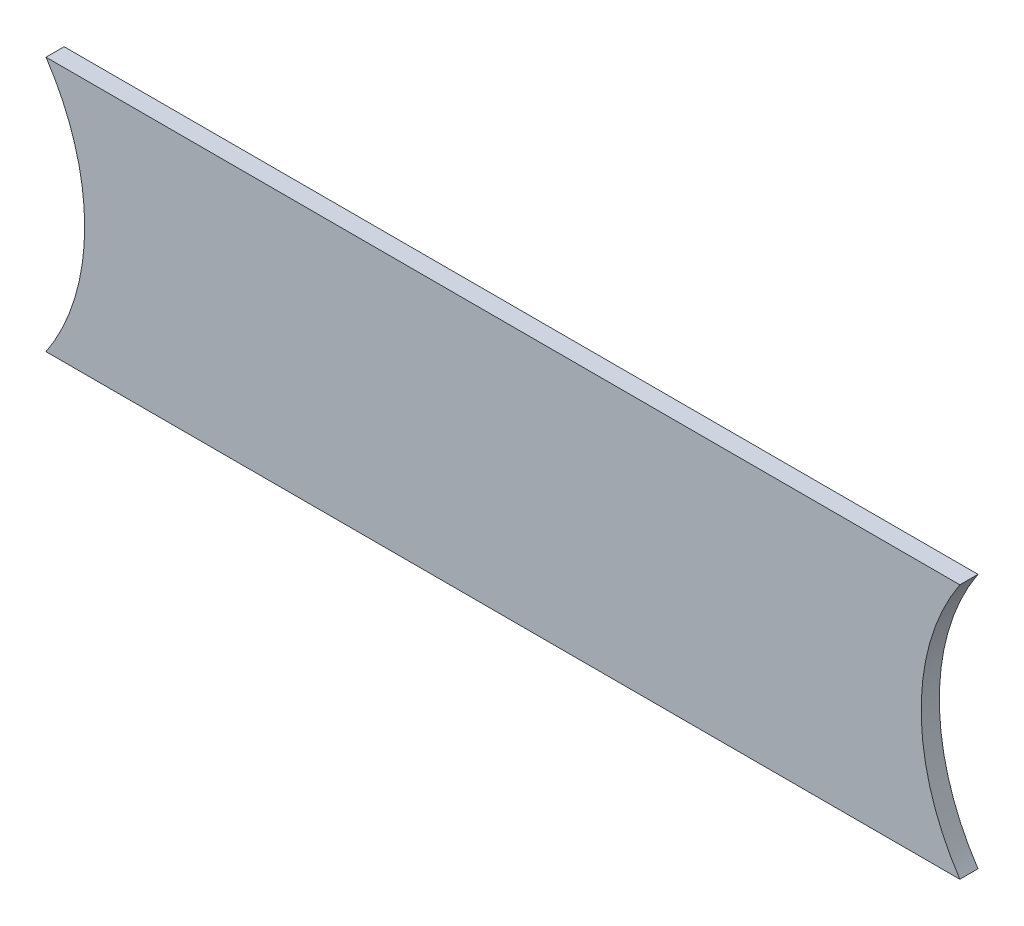
ISO-10303-21;
HEADER;
FILE_DESCRIPTION(('STEP AP214'),'2;1');
FILE_NAME('part.step','',(''),(''),'','','');
FILE_SCHEMA(('AUTOMOTIVE_DESIGN { 1 0 10303 214 1 1 1 1 }'));
ENDSEC;
DATA;
#1=APPLICATION_CONTEXT('core data for automotive mechanical design processes');
#2=APPLICATION_PROTOCOL_DEFINITION('international standard','automotive_design',2000,#1);
#3=PRODUCT_CONTEXT('',#1,'mechanical');
#4=PRODUCT('Part','Part','',(#3));
#5=PRODUCT_RELATED_PRODUCT_CATEGORY('part','',(#4));
#6=PRODUCT_DEFINITION_FORMATION('','',#4);
#7=PRODUCT_DEFINITION_CONTEXT('part definition',#1,'design');
#8=PRODUCT_DEFINITION('design','',#6,#7);
#9=PRODUCT_DEFINITION_SHAPE('','',#8);
#10=(LENGTH_UNIT() NAMED_UNIT(*) SI_UNIT(.MILLI.,.METRE.));
#11=(NAMED_UNIT(*) PLANE_ANGLE_UNIT() SI_UNIT($,.RADIAN.));
#12=(NAMED_UNIT(*) SI_UNIT($,.STERADIAN.) SOLID_ANGLE_UNIT());
#13=UNCERTAINTY_MEASURE_WITH_UNIT(LENGTH_MEASURE(1.E-05),#10,'distance_accuracy_value','');
#14=(GEOMETRIC_REPRESENTATION_CONTEXT(3) GLOBAL_UNCERTAINTY_ASSIGNED_CONTEXT((#13)) GLOBAL_UNIT_ASSIGNED_CONTEXT((#10,
#11,#12)) REPRESENTATION_CONTEXT('',''));
#15=CARTESIAN_POINT('',(0.,0.,0.));
#16=DIRECTION('',(0.,0.,1.));
#17=DIRECTION('',(1.,0.,0.));
#18=AXIS2_PLACEMENT_3D('',#15,#16,#17);
#19=CARTESIAN_POINT('',(81.7341749903459,116.7500205,0.));
#20=DIRECTION('',(0.,1.,0.));
#21=DIRECTION('',(1.,0.,0.));
#22=AXIS2_PLACEMENT_3D('',#19,#20,#21);
#23=PLANE('',#22);
#24=DIRECTION('',(1.,0.,0.));
#25=VECTOR('',#24,1.);
#26=CARTESIAN_POINT('',(81.36001,116.7500205,0.03556));
#27=LINE('',#26,#25);
#28=CARTESIAN_POINT('',(81.7341749903459,116.7500205,0.03556));
#29=VERTEX_POINT('',#28);
#30=CARTESIAN_POINT('',(83.5258450096541,116.7500205,0.03556));
#31=VERTEX_POINT('',#30);
#32=EDGE_CURVE('E11',#29,#31,#27,.T.);
#33=ORIENTED_EDGE('',*,*,#32,.F.);
#34=DIRECTION('',(0.,0.,1.));
#35=VECTOR('',#34,1.);
#36=CARTESIAN_POINT('',(81.7341749903459,116.7500205,0.));
#37=LINE('',#36,#35);
#38=CARTESIAN_POINT('',(81.7341749903459,116.7500205,0.));
#39=VERTEX_POINT('',#38);
#40=EDGE_CURVE('E24',#39,#29,#37,.T.);
#41=ORIENTED_EDGE('',*,*,#40,.F.);
#42=DIRECTION('',(1.,0.,0.));
#43=VECTOR('',#42,1.);
#44=CARTESIAN_POINT('',(81.36001,116.7500205,0.));
#45=LINE('',#44,#43);
#46=CARTESIAN_POINT('',(83.5258450096541,116.7500205,0.));
#47=VERTEX_POINT('',#46);
#48=EDGE_CURVE('E82',#39,#47,#45,.T.);
#49=ORIENTED_EDGE('',*,*,#48,.T.);
#50=DIRECTION('',(0.,0.,1.));
#51=VECTOR('',#50,1.);
#52=CARTESIAN_POINT('',(83.5258450096541,116.7500205,0.));
#53=LINE('',#52,#51);
#54=EDGE_CURVE('E37',#47,#31,#53,.T.);
#55=ORIENTED_EDGE('',*,*,#54,.T.);
#56=EDGE_LOOP('',(#33,#41,#49,#55));
#57=FACE_BOUND('',#56,.T.);
#58=ADVANCED_FACE('F17',(#57),#23,.F.);
#59=CARTESIAN_POINT('',(83.90001,117.00002,0.));
#60=DIRECTION('',(0.,0.,-1.));
#61=DIRECTION('',(1.,0.,0.));
#62=AXIS2_PLACEMENT_3D('',#59,#60,#61);
#63=CYLINDRICAL_SURFACE('',#62,0.4499991);
#64=DIRECTION('',(0.,0.,1.));
#65=VECTOR('',#64,1.);
#66=CARTESIAN_POINT('',(83.5258450096541,117.2500195,0.));
#67=LINE('',#66,#65);
#68=CARTESIAN_POINT('',(83.5258450096541,117.2500195,0.));
#69=VERTEX_POINT('',#68);
#70=CARTESIAN_POINT('',(83.5258450096541,117.2500195,0.03556));
#71=VERTEX_POINT('',#70);
#72=EDGE_CURVE('E97',#69,#71,#67,.T.);
#73=ORIENTED_EDGE('',*,*,#72,.T.);
#74=CARTESIAN_POINT('',(83.90001,117.00002,0.03556));
#75=DIRECTION('',(0.,0.,1.));
#76=DIRECTION('',(1.,0.,0.));
#77=AXIS2_PLACEMENT_3D('',#74,#75,#76);
#78=CIRCLE('',#77,0.4499991);
#79=EDGE_CURVE('E94',#71,#31,#78,.T.);
#80=ORIENTED_EDGE('',*,*,#79,.T.);
#81=ORIENTED_EDGE('',*,*,#54,.F.);
#82=CARTESIAN_POINT('',(83.90001,117.00002,0.));
#83=DIRECTION('',(0.,0.,1.));
#84=DIRECTION('',(1.,0.,0.));
#85=AXIS2_PLACEMENT_3D('',#82,#83,#84);
#86=CIRCLE('',#85,0.4499991);
#87=EDGE_CURVE('E92',#69,#47,#86,.T.);
#88=ORIENTED_EDGE('',*,*,#87,.F.);
#89=EDGE_LOOP('',(#73,#80,#81,#88));
#90=FACE_BOUND('',#89,.T.);
#91=ADVANCED_FACE('F102',(#90),#63,.F.);
#92=CARTESIAN_POINT('',(83.5258450096541,117.2500195,0.));
#93=DIRECTION('',(0.,-1.,0.));
#94=DIRECTION('',(-1.,0.,0.));
#95=AXIS2_PLACEMENT_3D('',#92,#93,#94);
#96=PLANE('',#95);
#97=DIRECTION('',(-1.,0.,0.));
#98=VECTOR('',#97,1.);
#99=CARTESIAN_POINT('',(83.90001,117.2500195,0.03556));
#100=LINE('',#99,#98);
#101=CARTESIAN_POINT('',(81.7341749903459,117.2500195,0.03556));
#102=VERTEX_POINT('',#101);
#103=EDGE_CURVE('E89',#71,#102,#100,.T.);
#104=ORIENTED_EDGE('',*,*,#103,.F.);
#105=ORIENTED_EDGE('',*,*,#72,.F.);
#106=DIRECTION('',(-1.,0.,0.));
#107=VECTOR('',#106,1.);
#108=CARTESIAN_POINT('',(83.90001,117.2500195,0.));
#109=LINE('',#108,#107);
#110=CARTESIAN_POINT('',(81.7341749903459,117.2500195,0.));
#111=VERTEX_POINT('',#110);
#112=EDGE_CURVE('E87',#69,#111,#109,.T.);
#113=ORIENTED_EDGE('',*,*,#112,.T.);
#114=DIRECTION('',(0.,0.,1.));
#115=VECTOR('',#114,1.);
#116=CARTESIAN_POINT('',(81.7341749903459,117.2500195,0.));
#117=LINE('',#116,#115);
#118=EDGE_CURVE('E69',#111,#102,#117,.T.);
#119=ORIENTED_EDGE('',*,*,#118,.T.);
#120=EDGE_LOOP('',(#104,#105,#113,#119));
#121=FACE_BOUND('',#120,.T.);
#122=ADVANCED_FACE('F108',(#121),#96,.F.);
#123=CARTESIAN_POINT('',(81.36001,117.00002,0.));
#124=DIRECTION('',(0.,0.,-1.));
#125=DIRECTION('',(1.,0.,0.));
#126=AXIS2_PLACEMENT_3D('',#123,#124,#125);
#127=CYLINDRICAL_SURFACE('',#126,0.4499991);
#128=DIRECTION('',(0.,0.,1.));
#129=VECTOR('',#128,1.);
#130=CARTESIAN_POINT('',(81.8100091,117.00002,0.));
#131=LINE('',#130,#129);
#132=CARTESIAN_POINT('',(81.8100091,117.00002,0.));
#133=VERTEX_POINT('',#132);
#134=CARTESIAN_POINT('',(81.8100091,117.00002,0.03556));
#135=VERTEX_POINT('',#134);
#136=EDGE_CURVE('E59',#133,#135,#131,.T.);
#137=ORIENTED_EDGE('',*,*,#136,.T.);
#138=CARTESIAN_POINT('',(81.36001,117.00002,0.03556));
#139=DIRECTION('',(0.,0.,1.));
#140=DIRECTION('',(1.,0.,0.));
#141=AXIS2_PLACEMENT_3D('',#138,#139,#140);
#142=CIRCLE('',#141,0.4499991);
#143=EDGE_CURVE('E70',#135,#102,#142,.T.);
#144=ORIENTED_EDGE('',*,*,#143,.T.);
#145=ORIENTED_EDGE('',*,*,#118,.F.);
#146=CARTESIAN_POINT('',(81.36001,117.00002,0.));
#147=DIRECTION('',(0.,0.,1.));
#148=DIRECTION('',(1.,0.,0.));
#149=AXIS2_PLACEMENT_3D('',#146,#147,#148);
#150=CIRCLE('',#149,0.4499991);
#151=EDGE_CURVE('E73',#133,#111,#150,.T.);
#152=ORIENTED_EDGE('',*,*,#151,.F.);
#153=EDGE_LOOP('',(#137,#144,#145,#152));
#154=FACE_BOUND('',#153,.T.);
#155=ADVANCED_FACE('F74',(#154),#127,.F.);
#156=CARTESIAN_POINT('',(81.36001,117.00002,0.));
#157=DIRECTION('',(0.,0.,-1.));
#158=DIRECTION('',(1.,0.,0.));
#159=AXIS2_PLACEMENT_3D('',#156,#157,#158);
#160=CYLINDRICAL_SURFACE('',#159,0.4499991);
#161=ORIENTED_EDGE('',*,*,#40,.T.);
#162=CARTESIAN_POINT('',(81.36001,117.00002,0.03556));
#163=DIRECTION('',(0.,0.,1.));
#164=DIRECTION('',(1.,0.,0.));
#165=AXIS2_PLACEMENT_3D('',#162,#163,#164);
#166=CIRCLE('',#165,0.4499991);
#167=EDGE_CURVE('E65',#29,#135,#166,.T.);
#168=ORIENTED_EDGE('',*,*,#167,.T.);
#169=ORIENTED_EDGE('',*,*,#136,.F.);
#170=EDGE_CURVE('E63',#39,#133,#150,.T.);
#171=ORIENTED_EDGE('',*,*,#170,.F.);
#172=EDGE_LOOP('',(#161,#168,#169,#171));
#173=FACE_BOUND('',#172,.T.);
#174=ADVANCED_FACE('F61',(#173),#160,.F.);
#175=CARTESIAN_POINT('',(81.36001,116.7500205,0.));
#176=DIRECTION('',(0.,0.,-1.));
#177=DIRECTION('',(-1.,0.,0.));
#178=AXIS2_PLACEMENT_3D('',#175,#176,#177);
#179=PLANE('',#178);
#180=ORIENTED_EDGE('',*,*,#48,.F.);
#181=ORIENTED_EDGE('',*,*,#170,.T.);
#182=ORIENTED_EDGE('',*,*,#151,.T.);
#183=ORIENTED_EDGE('',*,*,#112,.F.);
#184=ORIENTED_EDGE('',*,*,#87,.T.);
#185=EDGE_LOOP('',(#180,#181,#182,#183,#184));
#186=FACE_BOUND('',#185,.T.);
#187=ADVANCED_FACE('F80',(#186),#179,.T.);
#188=CARTESIAN_POINT('',(81.36001,116.7500205,0.03556));
#189=DIRECTION('',(0.,0.,-1.));
#190=DIRECTION('',(-1.,0.,0.));
#191=AXIS2_PLACEMENT_3D('',#188,#189,#190);
#192=PLANE('',#191);
#193=ORIENTED_EDGE('',*,*,#167,.F.);
#194=ORIENTED_EDGE('',*,*,#32,.T.);
#195=ORIENTED_EDGE('',*,*,#79,.F.);
#196=ORIENTED_EDGE('',*,*,#103,.T.);
#197=ORIENTED_EDGE('',*,*,#143,.F.);
#198=EDGE_LOOP('',(#193,#194,#195,#196,#197));
#199=FACE_BOUND('',#198,.T.);
#200=ADVANCED_FACE('F106',(#199),#192,.F.);
#201=CLOSED_SHELL('',(#58,#91,#122,#155,#174,#187,#200));
#202=MANIFOLD_SOLID_BREP('B1',#201);
#203=ADVANCED_BREP_SHAPE_REPRESENTATION('',(#18,#202),#14);
#204=SHAPE_DEFINITION_REPRESENTATION(#9,#203);
ENDSEC;
END-ISO-10303-21;
